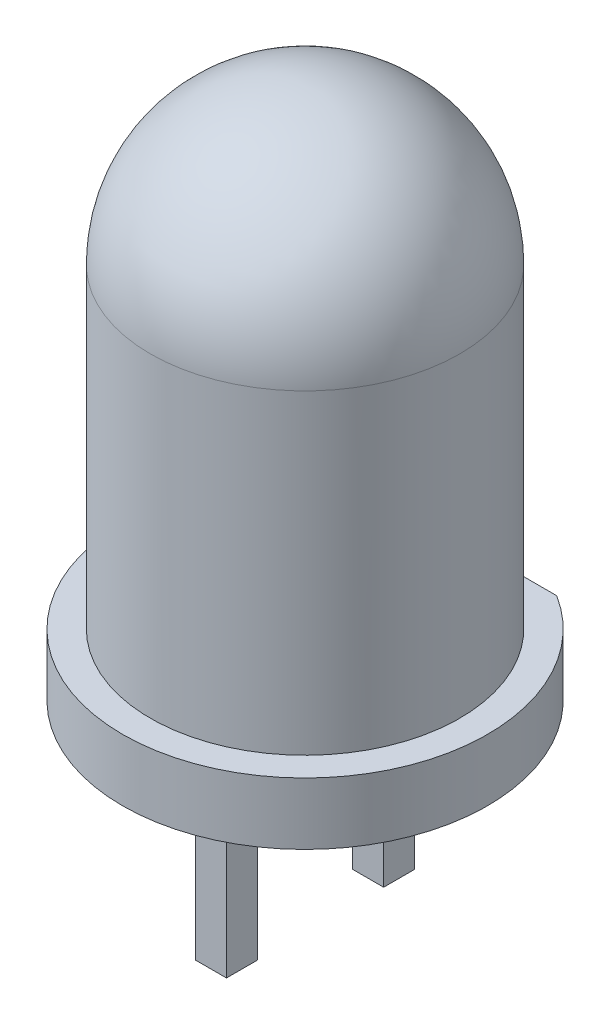
ISO-10303-21;
HEADER;
FILE_DESCRIPTION(('STEP AP214'),'2;1');
FILE_NAME('part.step','',(''),(''),'','','');
FILE_SCHEMA(('AUTOMOTIVE_DESIGN { 1 0 10303 214 1 1 1 1 }'));
ENDSEC;
DATA;
#1=APPLICATION_CONTEXT('core data for automotive mechanical design processes');
#2=APPLICATION_PROTOCOL_DEFINITION('international standard','automotive_design',2000,#1);
#3=PRODUCT_CONTEXT('',#1,'mechanical');
#4=PRODUCT('Part','Part','',(#3));
#5=PRODUCT_RELATED_PRODUCT_CATEGORY('part','',(#4));
#6=PRODUCT_DEFINITION_FORMATION('','',#4);
#7=PRODUCT_DEFINITION_CONTEXT('part definition',#1,'design');
#8=PRODUCT_DEFINITION('design','',#6,#7);
#9=PRODUCT_DEFINITION_SHAPE('','',#8);
#10=(LENGTH_UNIT() NAMED_UNIT(*) SI_UNIT(.MILLI.,.METRE.));
#11=(NAMED_UNIT(*) PLANE_ANGLE_UNIT() SI_UNIT($,.RADIAN.));
#12=(NAMED_UNIT(*) SI_UNIT($,.STERADIAN.) SOLID_ANGLE_UNIT());
#13=UNCERTAINTY_MEASURE_WITH_UNIT(LENGTH_MEASURE(1.E-05),#10,'distance_accuracy_value','');
#14=(GEOMETRIC_REPRESENTATION_CONTEXT(3) GLOBAL_UNCERTAINTY_ASSIGNED_CONTEXT((#13)) GLOBAL_UNIT_ASSIGNED_CONTEXT((#10,
#11,#12)) REPRESENTATION_CONTEXT('',''));
#15=CARTESIAN_POINT('',(0.,0.,0.));
#16=DIRECTION('',(0.,0.,1.));
#17=DIRECTION('',(1.,0.,0.));
#18=AXIS2_PLACEMENT_3D('',#15,#16,#17);
#19=CARTESIAN_POINT('',(0.,0.,0.));
#20=DIRECTION('',(0.,1.,0.));
#21=DIRECTION('',(0.,0.,1.));
#22=AXIS2_PLACEMENT_3D('',#19,#20,#21);
#23=PLANE('',#22);
#24=DIRECTION('',(0.,0.,1.));
#25=VECTOR('',#24,1.);
#26=CARTESIAN_POINT('',(0.25,0.,1.52));
#27=LINE('',#26,#25);
#28=CARTESIAN_POINT('',(0.25,0.,1.02));
#29=VERTEX_POINT('',#28);
#30=CARTESIAN_POINT('',(0.25,0.,1.52));
#31=VERTEX_POINT('',#30);
#32=EDGE_CURVE('E133',#29,#31,#27,.T.);
#33=ORIENTED_EDGE('',*,*,#32,.F.);
#34=DIRECTION('',(1.,0.,0.));
#35=VECTOR('',#34,1.);
#36=CARTESIAN_POINT('',(-0.25,0.,1.02));
#37=LINE('',#36,#35);
#38=CARTESIAN_POINT('',(-0.25,0.,1.02));
#39=VERTEX_POINT('',#38);
#40=EDGE_CURVE('E179',#39,#29,#37,.T.);
#41=ORIENTED_EDGE('',*,*,#40,.F.);
#42=DIRECTION('',(0.,0.,-1.));
#43=VECTOR('',#42,1.);
#44=CARTESIAN_POINT('',(-0.25,0.,1.52));
#45=LINE('',#44,#43);
#46=CARTESIAN_POINT('',(-0.25,0.,1.52));
#47=VERTEX_POINT('',#46);
#48=EDGE_CURVE('E195',#47,#39,#45,.T.);
#49=ORIENTED_EDGE('',*,*,#48,.F.);
#50=DIRECTION('',(-1.,0.,0.));
#51=VECTOR('',#50,1.);
#52=CARTESIAN_POINT('',(-0.25,0.,1.52));
#53=LINE('',#52,#51);
#54=EDGE_CURVE('E191',#31,#47,#53,.T.);
#55=ORIENTED_EDGE('',*,*,#54,.F.);
#56=EDGE_LOOP('',(#33,#41,#49,#55));
#57=FACE_BOUND('',#56,.T.);
#58=CARTESIAN_POINT('',(0.,0.,0.));
#59=DIRECTION('',(0.,1.,0.));
#60=DIRECTION('',(0.,0.,1.));
#61=AXIS2_PLACEMENT_3D('',#58,#59,#60);
#62=CIRCLE('',#61,2.95);
#63=CARTESIAN_POINT('',(-1.56604597633658,0.,-2.5));
#64=VERTEX_POINT('',#63);
#65=CARTESIAN_POINT('',(1.56604597633658,0.,-2.5));
#66=VERTEX_POINT('',#65);
#67=EDGE_CURVE('E226',#64,#66,#62,.T.);
#68=ORIENTED_EDGE('',*,*,#67,.F.);
#69=DIRECTION('',(1.,0.,0.));
#70=VECTOR('',#69,1.);
#71=CARTESIAN_POINT('',(0.,0.,-2.5));
#72=LINE('',#71,#70);
#73=EDGE_CURVE('E58',#64,#66,#72,.T.);
#74=ORIENTED_EDGE('',*,*,#73,.T.);
#75=EDGE_LOOP('',(#68,#74));
#76=FACE_BOUND('',#75,.T.);
#77=DIRECTION('',(0.,0.,1.));
#78=VECTOR('',#77,1.);
#79=CARTESIAN_POINT('',(0.25,0.,-1.02));
#80=LINE('',#79,#78);
#81=CARTESIAN_POINT('',(0.250000000000001,0.,-1.52));
#82=VERTEX_POINT('',#81);
#83=CARTESIAN_POINT('',(0.25,0.,-1.02));
#84=VERTEX_POINT('',#83);
#85=EDGE_CURVE('E126',#82,#84,#80,.T.);
#86=ORIENTED_EDGE('',*,*,#85,.F.);
#87=DIRECTION('',(1.,0.,0.));
#88=VECTOR('',#87,1.);
#89=CARTESIAN_POINT('',(-0.249999999999999,0.,-1.52));
#90=LINE('',#89,#88);
#91=CARTESIAN_POINT('',(-0.249999999999999,0.,-1.52));
#92=VERTEX_POINT('',#91);
#93=EDGE_CURVE('E128',#92,#82,#90,.T.);
#94=ORIENTED_EDGE('',*,*,#93,.F.);
#95=DIRECTION('',(0.,0.,-1.));
#96=VECTOR('',#95,1.);
#97=CARTESIAN_POINT('',(-0.25,0.,-1.02));
#98=LINE('',#97,#96);
#99=CARTESIAN_POINT('',(-0.25,0.,-1.02));
#100=VERTEX_POINT('',#99);
#101=EDGE_CURVE('E70',#100,#92,#98,.T.);
#102=ORIENTED_EDGE('',*,*,#101,.F.);
#103=DIRECTION('',(-1.,0.,0.));
#104=VECTOR('',#103,1.);
#105=CARTESIAN_POINT('',(-0.25,0.,-1.02));
#106=LINE('',#105,#104);
#107=EDGE_CURVE('E65',#84,#100,#106,.T.);
#108=ORIENTED_EDGE('',*,*,#107,.F.);
#109=EDGE_LOOP('',(#86,#94,#102,#108));
#110=FACE_BOUND('',#109,.T.);
#111=ADVANCED_FACE('F49',(#57,#76,#110),#23,.F.);
#112=CARTESIAN_POINT('',(0.,1.,0.));
#113=DIRECTION('',(0.,-1.,0.));
#114=DIRECTION('',(0.,0.,-1.));
#115=AXIS2_PLACEMENT_3D('',#112,#113,#114);
#116=CYLINDRICAL_SURFACE('',#115,2.95);
#117=CARTESIAN_POINT('',(0.,1.,0.));
#118=DIRECTION('',(0.,1.,0.));
#119=DIRECTION('',(0.,0.,1.));
#120=AXIS2_PLACEMENT_3D('',#117,#118,#119);
#121=CIRCLE('',#120,2.95);
#122=CARTESIAN_POINT('',(-1.56604597633658,1.,-2.5));
#123=VERTEX_POINT('',#122);
#124=CARTESIAN_POINT('',(1.56604597633658,1.,-2.5));
#125=VERTEX_POINT('',#124);
#126=EDGE_CURVE('E232',#123,#125,#121,.T.);
#127=ORIENTED_EDGE('',*,*,#126,.F.);
#128=DIRECTION('',(0.,1.,0.));
#129=VECTOR('',#128,1.);
#130=CARTESIAN_POINT('',(-1.56604597633658,-6.6,-2.5));
#131=LINE('',#130,#129);
#132=EDGE_CURVE('E221',#64,#123,#131,.T.);
#133=ORIENTED_EDGE('',*,*,#132,.F.);
#134=ORIENTED_EDGE('',*,*,#67,.T.);
#135=DIRECTION('',(0.,1.,0.));
#136=VECTOR('',#135,1.);
#137=CARTESIAN_POINT('',(1.56604597633658,-6.6,-2.5));
#138=LINE('',#137,#136);
#139=EDGE_CURVE('E222',#66,#125,#138,.T.);
#140=ORIENTED_EDGE('',*,*,#139,.T.);
#141=EDGE_LOOP('',(#127,#133,#134,#140));
#142=FACE_BOUND('',#141,.T.);
#143=ADVANCED_FACE('F247',(#142),#116,.T.);
#144=CARTESIAN_POINT('',(0.,1.,0.));
#145=DIRECTION('',(0.,1.,0.));
#146=DIRECTION('',(0.,0.,1.));
#147=AXIS2_PLACEMENT_3D('',#144,#145,#146);
#148=PLANE('',#147);
#149=DIRECTION('',(1.,0.,0.));
#150=VECTOR('',#149,1.);
#151=CARTESIAN_POINT('',(0.,1.,-2.5));
#152=LINE('',#151,#150);
#153=CARTESIAN_POINT('',(0.,1.,-2.5));
#154=VERTEX_POINT('',#153);
#155=EDGE_CURVE('E218',#123,#154,#152,.T.);
#156=ORIENTED_EDGE('',*,*,#155,.F.);
#157=ORIENTED_EDGE('',*,*,#126,.T.);
#158=EDGE_CURVE('E217',#154,#125,#152,.T.);
#159=ORIENTED_EDGE('',*,*,#158,.F.);
#160=CARTESIAN_POINT('',(0.,1.,0.));
#161=DIRECTION('',(0.,1.,0.));
#162=DIRECTION('',(0.,0.,1.));
#163=AXIS2_PLACEMENT_3D('',#160,#161,#162);
#164=CIRCLE('',#163,2.5);
#165=EDGE_CURVE('E228',#154,#154,#164,.T.);
#166=ORIENTED_EDGE('',*,*,#165,.F.);
#167=EDGE_LOOP('',(#156,#157,#159,#166));
#168=FACE_BOUND('',#167,.T.);
#169=ADVANCED_FACE('F253',(#168),#148,.T.);
#170=CARTESIAN_POINT('',(0.,8.6,0.));
#171=DIRECTION('',(0.,-1.,0.));
#172=DIRECTION('',(0.,0.,-1.));
#173=AXIS2_PLACEMENT_3D('',#170,#171,#172);
#174=CYLINDRICAL_SURFACE('',#173,2.5);
#175=CARTESIAN_POINT('',(0.,6.1,0.));
#176=DIRECTION('',(0.,-1.,0.));
#177=DIRECTION('',(0.,0.,-1.));
#178=AXIS2_PLACEMENT_3D('',#175,#176,#177);
#179=CIRCLE('',#178,2.5);
#180=CARTESIAN_POINT('',(0.,6.1,-2.5));
#181=VERTEX_POINT('',#180);
#182=EDGE_CURVE('E11',#181,#181,#179,.T.);
#183=ORIENTED_EDGE('',*,*,#182,.T.);
#184=EDGE_LOOP('',(#183));
#185=FACE_BOUND('',#184,.T.);
#186=ORIENTED_EDGE('',*,*,#165,.T.);
#187=EDGE_LOOP('',(#186));
#188=FACE_BOUND('',#187,.T.);
#189=ADVANCED_FACE('F255',(#185,#188),#174,.T.);
#190=CARTESIAN_POINT('',(0.,-6.6,-2.5));
#191=DIRECTION('',(0.,0.,1.));
#192=DIRECTION('',(1.,0.,0.));
#193=AXIS2_PLACEMENT_3D('',#190,#191,#192);
#194=PLANE('',#193);
#195=ORIENTED_EDGE('',*,*,#132,.T.);
#196=ORIENTED_EDGE('',*,*,#155,.T.);
#197=ORIENTED_EDGE('',*,*,#158,.T.);
#198=ORIENTED_EDGE('',*,*,#139,.F.);
#199=ORIENTED_EDGE('',*,*,#73,.F.);
#200=EDGE_LOOP('',(#195,#196,#197,#198,#199));
#201=FACE_BOUND('',#200,.T.);
#202=ADVANCED_FACE('F249',(#201),#194,.F.);
#203=CARTESIAN_POINT('',(0.,6.1,0.));
#204=DIRECTION('',(0.,1.,0.));
#205=DIRECTION('',(0.,0.,1.));
#206=AXIS2_PLACEMENT_3D('',#203,#204,#205);
#207=SPHERICAL_SURFACE('',#206,2.5);
#208=ORIENTED_EDGE('',*,*,#182,.F.);
#209=EDGE_LOOP('',(#208));
#210=FACE_BOUND('',#209,.T.);
#211=ADVANCED_FACE('F51',(#210),#207,.T.);
#212=CARTESIAN_POINT('',(0.25,-3.,1.52));
#213=DIRECTION('',(-1.,0.,0.));
#214=DIRECTION('',(0.,0.,1.));
#215=AXIS2_PLACEMENT_3D('',#212,#213,#214);
#216=PLANE('',#215);
#217=ORIENTED_EDGE('',*,*,#32,.T.);
#218=DIRECTION('',(0.,1.,0.));
#219=VECTOR('',#218,1.);
#220=CARTESIAN_POINT('',(0.25,-3.,1.52));
#221=LINE('',#220,#219);
#222=CARTESIAN_POINT('',(0.25,-3.,1.52));
#223=VERTEX_POINT('',#222);
#224=EDGE_CURVE('E213',#223,#31,#221,.T.);
#225=ORIENTED_EDGE('',*,*,#224,.F.);
#226=DIRECTION('',(0.,0.,1.));
#227=VECTOR('',#226,1.);
#228=CARTESIAN_POINT('',(0.25,-3.,1.52));
#229=LINE('',#228,#227);
#230=CARTESIAN_POINT('',(0.25,-3.,1.02));
#231=VERTEX_POINT('',#230);
#232=EDGE_CURVE('E174',#231,#223,#229,.T.);
#233=ORIENTED_EDGE('',*,*,#232,.F.);
#234=DIRECTION('',(0.,1.,0.));
#235=VECTOR('',#234,1.);
#236=CARTESIAN_POINT('',(0.25,-3.,1.02));
#237=LINE('',#236,#235);
#238=EDGE_CURVE('E188',#231,#29,#237,.T.);
#239=ORIENTED_EDGE('',*,*,#238,.T.);
#240=EDGE_LOOP('',(#217,#225,#233,#239));
#241=FACE_BOUND('',#240,.T.);
#242=ADVANCED_FACE('F279',(#241),#216,.F.);
#243=CARTESIAN_POINT('',(-0.25,-3.,1.52));
#244=DIRECTION('',(0.,0.,-1.));
#245=DIRECTION('',(-1.,0.,0.));
#246=AXIS2_PLACEMENT_3D('',#243,#244,#245);
#247=PLANE('',#246);
#248=ORIENTED_EDGE('',*,*,#54,.T.);
#249=DIRECTION('',(0.,1.,0.));
#250=VECTOR('',#249,1.);
#251=CARTESIAN_POINT('',(-0.25,-3.,1.52));
#252=LINE('',#251,#250);
#253=CARTESIAN_POINT('',(-0.25,-3.,1.52));
#254=VERTEX_POINT('',#253);
#255=EDGE_CURVE('E209',#254,#47,#252,.T.);
#256=ORIENTED_EDGE('',*,*,#255,.F.);
#257=DIRECTION('',(-1.,0.,0.));
#258=VECTOR('',#257,1.);
#259=CARTESIAN_POINT('',(-0.25,-3.,1.52));
#260=LINE('',#259,#258);
#261=EDGE_CURVE('E178',#223,#254,#260,.T.);
#262=ORIENTED_EDGE('',*,*,#261,.F.);
#263=ORIENTED_EDGE('',*,*,#224,.T.);
#264=EDGE_LOOP('',(#248,#256,#262,#263));
#265=FACE_BOUND('',#264,.T.);
#266=ADVANCED_FACE('F287',(#265),#247,.F.);
#267=CARTESIAN_POINT('',(-0.25,-3.,1.52));
#268=DIRECTION('',(1.,0.,0.));
#269=DIRECTION('',(0.,0.,-1.));
#270=AXIS2_PLACEMENT_3D('',#267,#268,#269);
#271=PLANE('',#270);
#272=ORIENTED_EDGE('',*,*,#48,.T.);
#273=DIRECTION('',(0.,1.,0.));
#274=VECTOR('',#273,1.);
#275=CARTESIAN_POINT('',(-0.25,-3.,1.02));
#276=LINE('',#275,#274);
#277=CARTESIAN_POINT('',(-0.25,-3.,1.02));
#278=VERTEX_POINT('',#277);
#279=EDGE_CURVE('E205',#278,#39,#276,.T.);
#280=ORIENTED_EDGE('',*,*,#279,.F.);
#281=DIRECTION('',(0.,0.,-1.));
#282=VECTOR('',#281,1.);
#283=CARTESIAN_POINT('',(-0.25,-3.,1.52));
#284=LINE('',#283,#282);
#285=EDGE_CURVE('E182',#254,#278,#284,.T.);
#286=ORIENTED_EDGE('',*,*,#285,.F.);
#287=ORIENTED_EDGE('',*,*,#255,.T.);
#288=EDGE_LOOP('',(#272,#280,#286,#287));
#289=FACE_BOUND('',#288,.T.);
#290=ADVANCED_FACE('F285',(#289),#271,.F.);
#291=CARTESIAN_POINT('',(-0.25,-3.,1.02));
#292=DIRECTION('',(0.,0.,1.));
#293=DIRECTION('',(1.,0.,0.));
#294=AXIS2_PLACEMENT_3D('',#291,#292,#293);
#295=PLANE('',#294);
#296=ORIENTED_EDGE('',*,*,#40,.T.);
#297=ORIENTED_EDGE('',*,*,#238,.F.);
#298=DIRECTION('',(1.,0.,0.));
#299=VECTOR('',#298,1.);
#300=CARTESIAN_POINT('',(-0.25,-3.,1.02));
#301=LINE('',#300,#299);
#302=EDGE_CURVE('E185',#278,#231,#301,.T.);
#303=ORIENTED_EDGE('',*,*,#302,.F.);
#304=ORIENTED_EDGE('',*,*,#279,.T.);
#305=EDGE_LOOP('',(#296,#297,#303,#304));
#306=FACE_BOUND('',#305,.T.);
#307=ADVANCED_FACE('F275',(#306),#295,.F.);
#308=CARTESIAN_POINT('',(0.,-3.,0.));
#309=DIRECTION('',(0.,-1.,0.));
#310=DIRECTION('',(0.,0.,-1.));
#311=AXIS2_PLACEMENT_3D('',#308,#309,#310);
#312=PLANE('',#311);
#313=ORIENTED_EDGE('',*,*,#232,.T.);
#314=ORIENTED_EDGE('',*,*,#261,.T.);
#315=ORIENTED_EDGE('',*,*,#285,.T.);
#316=ORIENTED_EDGE('',*,*,#302,.T.);
#317=EDGE_LOOP('',(#313,#314,#315,#316));
#318=FACE_BOUND('',#317,.T.);
#319=ADVANCED_FACE('F281',(#318),#312,.T.);
#320=CARTESIAN_POINT('',(0.25,-3.,-1.02));
#321=DIRECTION('',(-1.,0.,0.));
#322=DIRECTION('',(0.,0.,1.));
#323=AXIS2_PLACEMENT_3D('',#320,#321,#322);
#324=PLANE('',#323);
#325=ORIENTED_EDGE('',*,*,#85,.T.);
#326=DIRECTION('',(0.,1.,0.));
#327=VECTOR('',#326,1.);
#328=CARTESIAN_POINT('',(0.25,-3.,-1.02));
#329=LINE('',#328,#327);
#330=CARTESIAN_POINT('',(0.25,-3.,-1.02));
#331=VERTEX_POINT('',#330);
#332=EDGE_CURVE('E480',#331,#84,#329,.T.);
#333=ORIENTED_EDGE('',*,*,#332,.F.);
#334=DIRECTION('',(0.,0.,1.));
#335=VECTOR('',#334,1.);
#336=CARTESIAN_POINT('',(0.25,-3.,-1.02));
#337=LINE('',#336,#335);
#338=CARTESIAN_POINT('',(0.250000000000001,-3.,-1.52));
#339=VERTEX_POINT('',#338);
#340=EDGE_CURVE('E145',#339,#331,#337,.T.);
#341=ORIENTED_EDGE('',*,*,#340,.F.);
#342=DIRECTION('',(0.,1.,0.));
#343=VECTOR('',#342,1.);
#344=CARTESIAN_POINT('',(0.250000000000001,-3.,-1.52));
#345=LINE('',#344,#343);
#346=EDGE_CURVE('E140',#339,#82,#345,.T.);
#347=ORIENTED_EDGE('',*,*,#346,.T.);
#348=EDGE_LOOP('',(#325,#333,#341,#347));
#349=FACE_BOUND('',#348,.T.);
#350=ADVANCED_FACE('F147',(#349),#324,.F.);
#351=CARTESIAN_POINT('',(-0.25,-3.,-1.02));
#352=DIRECTION('',(0.,0.,-1.));
#353=DIRECTION('',(-1.,0.,0.));
#354=AXIS2_PLACEMENT_3D('',#351,#352,#353);
#355=PLANE('',#354);
#356=ORIENTED_EDGE('',*,*,#107,.T.);
#357=DIRECTION('',(0.,1.,0.));
#358=VECTOR('',#357,1.);
#359=CARTESIAN_POINT('',(-0.25,-3.,-1.02));
#360=LINE('',#359,#358);
#361=CARTESIAN_POINT('',(-0.25,-3.,-1.02));
#362=VERTEX_POINT('',#361);
#363=EDGE_CURVE('E159',#362,#100,#360,.T.);
#364=ORIENTED_EDGE('',*,*,#363,.F.);
#365=DIRECTION('',(-1.,0.,0.));
#366=VECTOR('',#365,1.);
#367=CARTESIAN_POINT('',(-0.25,-3.,-1.02));
#368=LINE('',#367,#366);
#369=EDGE_CURVE('E169',#331,#362,#368,.T.);
#370=ORIENTED_EDGE('',*,*,#369,.F.);
#371=ORIENTED_EDGE('',*,*,#332,.T.);
#372=EDGE_LOOP('',(#356,#364,#370,#371));
#373=FACE_BOUND('',#372,.T.);
#374=ADVANCED_FACE('F310',(#373),#355,.F.);
#375=CARTESIAN_POINT('',(-0.25,-3.,-1.02));
#376=DIRECTION('',(1.,0.,0.));
#377=DIRECTION('',(0.,0.,-1.));
#378=AXIS2_PLACEMENT_3D('',#375,#376,#377);
#379=PLANE('',#378);
#380=ORIENTED_EDGE('',*,*,#101,.T.);
#381=DIRECTION('',(0.,1.,0.));
#382=VECTOR('',#381,1.);
#383=CARTESIAN_POINT('',(-0.249999999999999,-3.,-1.52));
#384=LINE('',#383,#382);
#385=CARTESIAN_POINT('',(-0.249999999999999,-3.,-1.52));
#386=VERTEX_POINT('',#385);
#387=EDGE_CURVE('E143',#386,#92,#384,.T.);
#388=ORIENTED_EDGE('',*,*,#387,.F.);
#389=DIRECTION('',(0.,0.,-1.));
#390=VECTOR('',#389,1.);
#391=CARTESIAN_POINT('',(-0.25,-3.,-1.02));
#392=LINE('',#391,#390);
#393=EDGE_CURVE('E156',#362,#386,#392,.T.);
#394=ORIENTED_EDGE('',*,*,#393,.F.);
#395=ORIENTED_EDGE('',*,*,#363,.T.);
#396=EDGE_LOOP('',(#380,#388,#394,#395));
#397=FACE_BOUND('',#396,.T.);
#398=ADVANCED_FACE('F307',(#397),#379,.F.);
#399=CARTESIAN_POINT('',(-0.249999999999999,-3.,-1.52));
#400=DIRECTION('',(0.,0.,1.));
#401=DIRECTION('',(1.,0.,0.));
#402=AXIS2_PLACEMENT_3D('',#399,#400,#401);
#403=PLANE('',#402);
#404=ORIENTED_EDGE('',*,*,#93,.T.);
#405=ORIENTED_EDGE('',*,*,#346,.F.);
#406=DIRECTION('',(1.,0.,0.));
#407=VECTOR('',#406,1.);
#408=CARTESIAN_POINT('',(-0.249999999999999,-3.,-1.52));
#409=LINE('',#408,#407);
#410=EDGE_CURVE('E150',#386,#339,#409,.T.);
#411=ORIENTED_EDGE('',*,*,#410,.F.);
#412=ORIENTED_EDGE('',*,*,#387,.T.);
#413=EDGE_LOOP('',(#404,#405,#411,#412));
#414=FACE_BOUND('',#413,.T.);
#415=ADVANCED_FACE('F138',(#414),#403,.F.);
#416=CARTESIAN_POINT('',(0.,-3.,0.));
#417=DIRECTION('',(0.,-1.,0.));
#418=DIRECTION('',(0.,0.,-1.));
#419=AXIS2_PLACEMENT_3D('',#416,#417,#418);
#420=PLANE('',#419);
#421=ORIENTED_EDGE('',*,*,#340,.T.);
#422=ORIENTED_EDGE('',*,*,#369,.T.);
#423=ORIENTED_EDGE('',*,*,#393,.T.);
#424=ORIENTED_EDGE('',*,*,#410,.T.);
#425=EDGE_LOOP('',(#421,#422,#423,#424));
#426=FACE_BOUND('',#425,.T.);
#427=ADVANCED_FACE('F301',(#426),#420,.T.);
#428=CLOSED_SHELL('',(#111,#143,#169,#189,#202,#211,#242,#266,#290,#307,#319,#350,#374,#398,
#415,#427));
#429=MANIFOLD_SOLID_BREP('B2',#428);
#430=ADVANCED_BREP_SHAPE_REPRESENTATION('',(#18,#429),#14);
#431=SHAPE_DEFINITION_REPRESENTATION(#9,#430);
ENDSEC;
END-ISO-10303-21;
